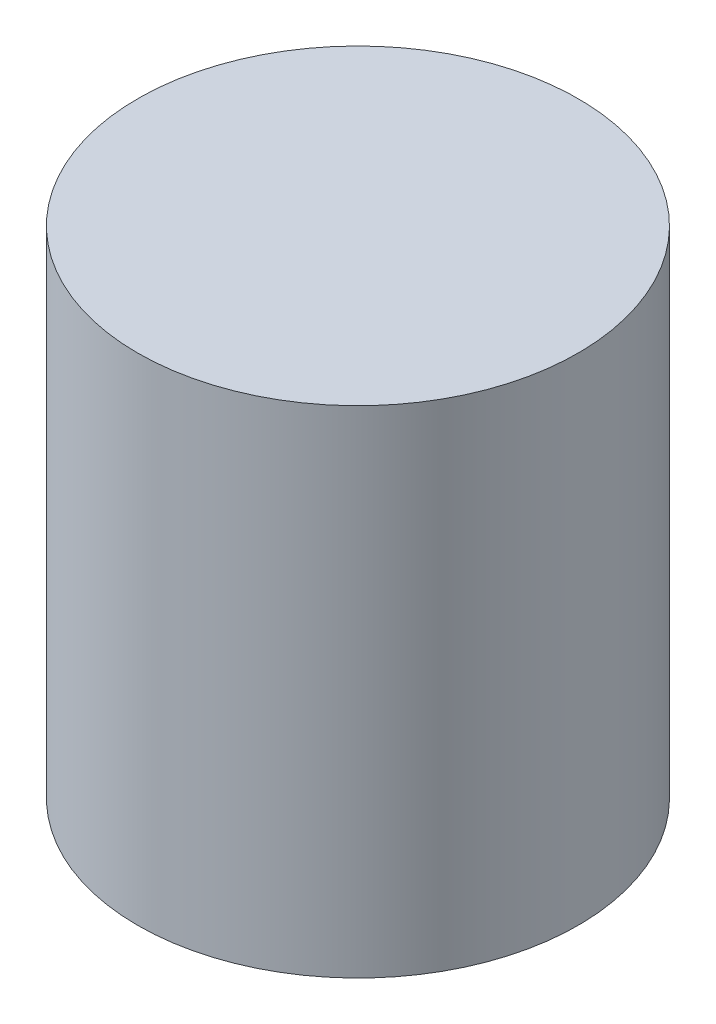
ISO-10303-21;
HEADER;
FILE_DESCRIPTION(('STEP AP214'),'2;1');
FILE_NAME('part.step','',(''),(''),'','','');
FILE_SCHEMA(('AUTOMOTIVE_DESIGN { 1 0 10303 214 1 1 1 1 }'));
ENDSEC;
DATA;
#1=APPLICATION_CONTEXT('core data for automotive mechanical design processes');
#2=APPLICATION_PROTOCOL_DEFINITION('international standard','automotive_design',2000,#1);
#3=PRODUCT_CONTEXT('',#1,'mechanical');
#4=PRODUCT('Part','Part','',(#3));
#5=PRODUCT_RELATED_PRODUCT_CATEGORY('part','',(#4));
#6=PRODUCT_DEFINITION_FORMATION('','',#4);
#7=PRODUCT_DEFINITION_CONTEXT('part definition',#1,'design');
#8=PRODUCT_DEFINITION('design','',#6,#7);
#9=PRODUCT_DEFINITION_SHAPE('','',#8);
#10=(LENGTH_UNIT() NAMED_UNIT(*) SI_UNIT(.MILLI.,.METRE.));
#11=(NAMED_UNIT(*) PLANE_ANGLE_UNIT() SI_UNIT($,.RADIAN.));
#12=(NAMED_UNIT(*) SI_UNIT($,.STERADIAN.) SOLID_ANGLE_UNIT());
#13=UNCERTAINTY_MEASURE_WITH_UNIT(LENGTH_MEASURE(1.E-05),#10,'distance_accuracy_value','');
#14=(GEOMETRIC_REPRESENTATION_CONTEXT(3) GLOBAL_UNCERTAINTY_ASSIGNED_CONTEXT((#13)) GLOBAL_UNIT_ASSIGNED_CONTEXT((#10,
#11,#12)) REPRESENTATION_CONTEXT('',''));
#15=CARTESIAN_POINT('',(0.,0.,0.));
#16=DIRECTION('',(0.,0.,1.));
#17=DIRECTION('',(1.,0.,0.));
#18=AXIS2_PLACEMENT_3D('',#15,#16,#17);
#19=CARTESIAN_POINT('',(0.,9.,0.));
#20=DIRECTION('',(0.,-1.,0.));
#21=DIRECTION('',(0.,0.,-1.));
#22=AXIS2_PLACEMENT_3D('',#19,#20,#21);
#23=CYLINDRICAL_SURFACE('',#22,4.);
#24=CARTESIAN_POINT('',(0.,9.,0.));
#25=DIRECTION('',(0.,1.,0.));
#26=DIRECTION('',(0.,0.,1.));
#27=AXIS2_PLACEMENT_3D('',#24,#25,#26);
#28=CIRCLE('',#27,4.);
#29=CARTESIAN_POINT('',(0.,9.,4.));
#30=VERTEX_POINT('',#29);
#31=EDGE_CURVE('E10',#30,#30,#28,.T.);
#32=ORIENTED_EDGE('',*,*,#31,.F.);
#33=EDGE_LOOP('',(#32));
#34=FACE_BOUND('',#33,.T.);
#35=CARTESIAN_POINT('',(0.,0.,0.));
#36=DIRECTION('',(0.,1.,0.));
#37=DIRECTION('',(0.,0.,1.));
#38=AXIS2_PLACEMENT_3D('',#35,#36,#37);
#39=CIRCLE('',#38,4.);
#40=CARTESIAN_POINT('',(0.,0.,4.));
#41=VERTEX_POINT('',#40);
#42=EDGE_CURVE('E34',#41,#41,#39,.T.);
#43=ORIENTED_EDGE('',*,*,#42,.T.);
#44=EDGE_LOOP('',(#43));
#45=FACE_BOUND('',#44,.T.);
#46=ADVANCED_FACE('F31',(#34,#45),#23,.T.);
#47=CARTESIAN_POINT('',(0.,9.,0.));
#48=DIRECTION('',(0.,1.,0.));
#49=DIRECTION('',(0.,0.,1.));
#50=AXIS2_PLACEMENT_3D('',#47,#48,#49);
#51=PLANE('',#50);
#52=ORIENTED_EDGE('',*,*,#31,.T.);
#53=EDGE_LOOP('',(#52));
#54=FACE_BOUND('',#53,.T.);
#55=ADVANCED_FACE('F46',(#54),#51,.T.);
#56=CARTESIAN_POINT('',(0.,0.,0.));
#57=DIRECTION('',(0.,1.,0.));
#58=DIRECTION('',(0.,0.,1.));
#59=AXIS2_PLACEMENT_3D('',#56,#57,#58);
#60=PLANE('',#59);
#61=ORIENTED_EDGE('',*,*,#42,.F.);
#62=EDGE_LOOP('',(#61));
#63=FACE_BOUND('',#62,.T.);
#64=ADVANCED_FACE('F44',(#63),#60,.F.);
#65=CLOSED_SHELL('',(#46,#55,#64));
#66=MANIFOLD_SOLID_BREP('B2',#65);
#67=ADVANCED_BREP_SHAPE_REPRESENTATION('',(#18,#66),#14);
#68=SHAPE_DEFINITION_REPRESENTATION(#9,#67);
ENDSEC;
END-ISO-10303-21;
